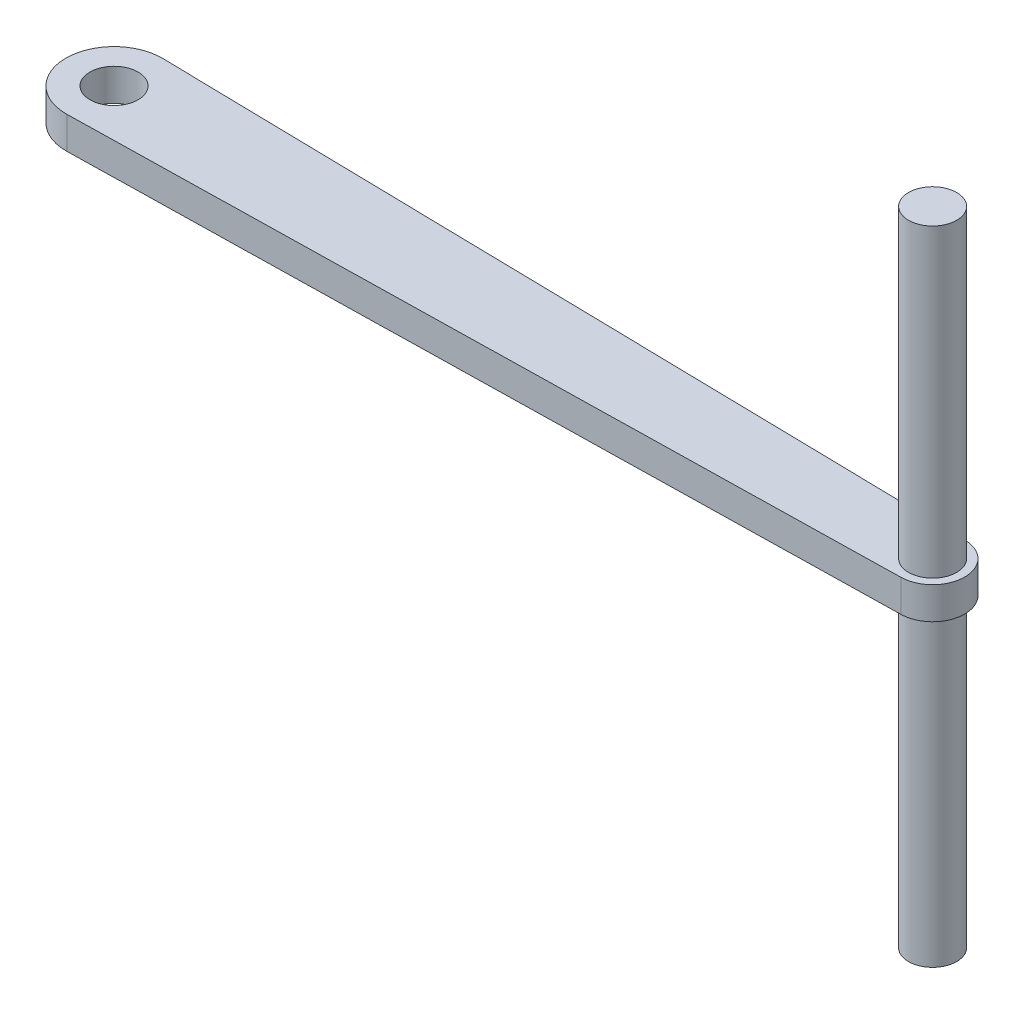
ISO-10303-21;
HEADER;
FILE_DESCRIPTION(('STEP AP214'),'2;1');
FILE_NAME('part.step','',(''),(''),'','','');
FILE_SCHEMA(('AUTOMOTIVE_DESIGN { 1 0 10303 214 1 1 1 1 }'));
ENDSEC;
DATA;
#1=APPLICATION_CONTEXT('core data for automotive mechanical design processes');
#2=APPLICATION_PROTOCOL_DEFINITION('international standard','automotive_design',2000,#1);
#3=PRODUCT_CONTEXT('',#1,'mechanical');
#4=PRODUCT('Part','Part','',(#3));
#5=PRODUCT_RELATED_PRODUCT_CATEGORY('part','',(#4));
#6=PRODUCT_DEFINITION_FORMATION('','',#4);
#7=PRODUCT_DEFINITION_CONTEXT('part definition',#1,'design');
#8=PRODUCT_DEFINITION('design','',#6,#7);
#9=PRODUCT_DEFINITION_SHAPE('','',#8);
#10=(LENGTH_UNIT() NAMED_UNIT(*) SI_UNIT(.MILLI.,.METRE.));
#11=(NAMED_UNIT(*) PLANE_ANGLE_UNIT() SI_UNIT($,.RADIAN.));
#12=(NAMED_UNIT(*) SI_UNIT($,.STERADIAN.) SOLID_ANGLE_UNIT());
#13=UNCERTAINTY_MEASURE_WITH_UNIT(LENGTH_MEASURE(1.E-05),#10,'distance_accuracy_value','');
#14=(GEOMETRIC_REPRESENTATION_CONTEXT(3) GLOBAL_UNCERTAINTY_ASSIGNED_CONTEXT((#13)) GLOBAL_UNIT_ASSIGNED_CONTEXT((#10,
#11,#12)) REPRESENTATION_CONTEXT('',''));
#15=CARTESIAN_POINT('',(0.,0.,0.));
#16=DIRECTION('',(0.,0.,1.));
#17=DIRECTION('',(1.,0.,0.));
#18=AXIS2_PLACEMENT_3D('',#15,#16,#17);
#19=CARTESIAN_POINT('',(0.,20.,0.));
#20=DIRECTION('',(0.,-1.,0.));
#21=DIRECTION('',(0.,0.,-1.));
#22=AXIS2_PLACEMENT_3D('',#19,#20,#21);
#23=CYLINDRICAL_SURFACE('',#22,1.5);
#24=CARTESIAN_POINT('',(0.,1.,0.));
#25=DIRECTION('',(0.,1.,0.));
#26=DIRECTION('',(0.,0.,1.));
#27=AXIS2_PLACEMENT_3D('',#24,#25,#26);
#28=CIRCLE('',#27,1.5);
#29=CARTESIAN_POINT('',(0.,1.,1.5));
#30=VERTEX_POINT('',#29);
#31=EDGE_CURVE('E44',#30,#30,#28,.T.);
#32=ORIENTED_EDGE('',*,*,#31,.T.);
#33=EDGE_LOOP('',(#32));
#34=FACE_BOUND('',#33,.T.);
#35=CARTESIAN_POINT('',(0.,20.,0.));
#36=DIRECTION('',(0.,1.,0.));
#37=DIRECTION('',(0.,0.,1.));
#38=AXIS2_PLACEMENT_3D('',#35,#36,#37);
#39=CIRCLE('',#38,1.5);
#40=CARTESIAN_POINT('',(0.,20.,1.5));
#41=VERTEX_POINT('',#40);
#42=EDGE_CURVE('E51',#41,#41,#39,.T.);
#43=ORIENTED_EDGE('',*,*,#42,.F.);
#44=EDGE_LOOP('',(#43));
#45=FACE_BOUND('',#44,.T.);
#46=ADVANCED_FACE('F41',(#34,#45),#23,.T.);
#47=CARTESIAN_POINT('',(0.,20.,0.));
#48=DIRECTION('',(0.,1.,0.));
#49=DIRECTION('',(0.,0.,1.));
#50=AXIS2_PLACEMENT_3D('',#47,#48,#49);
#51=PLANE('',#50);
#52=ORIENTED_EDGE('',*,*,#42,.T.);
#53=EDGE_LOOP('',(#52));
#54=FACE_BOUND('',#53,.T.);
#55=ADVANCED_FACE('F148',(#54),#51,.T.);
#56=CARTESIAN_POINT('',(-51.,1.,0.));
#57=DIRECTION('',(0.,1.,0.));
#58=DIRECTION('',(0.,0.,1.));
#59=AXIS2_PLACEMENT_3D('',#56,#57,#58);
#60=PLANE('',#59);
#61=ORIENTED_EDGE('',*,*,#31,.F.);
#62=EDGE_LOOP('',(#61));
#63=FACE_BOUND('',#62,.T.);
#64=CARTESIAN_POINT('',(-51.,1.,0.));
#65=DIRECTION('',(0.,1.,0.));
#66=DIRECTION('',(0.,0.,1.));
#67=AXIS2_PLACEMENT_3D('',#64,#65,#66);
#68=CIRCLE('',#67,3.);
#69=CARTESIAN_POINT('',(-50.9411764705882,1.,-2.99942324328987));
#70=VERTEX_POINT('',#69);
#71=CARTESIAN_POINT('',(-50.9411764705882,1.,2.99942324328987));
#72=VERTEX_POINT('',#71);
#73=EDGE_CURVE('E96',#70,#72,#68,.T.);
#74=ORIENTED_EDGE('',*,*,#73,.T.);
#75=DIRECTION('',(0.999807747763291,0.,-0.0196078431372549));
#76=VECTOR('',#75,1.);
#77=CARTESIAN_POINT('',(-50.9411764705882,1.,2.99942324328987));
#78=LINE('',#77,#76);
#79=CARTESIAN_POINT('',(0.0392156862745099,1.,1.99961549552658));
#80=VERTEX_POINT('',#79);
#81=EDGE_CURVE('E90',#72,#80,#78,.T.);
#82=ORIENTED_EDGE('',*,*,#81,.T.);
#83=CARTESIAN_POINT('',(0.,1.,0.));
#84=DIRECTION('',(0.,1.,0.));
#85=DIRECTION('',(0.,0.,1.));
#86=AXIS2_PLACEMENT_3D('',#83,#84,#85);
#87=CIRCLE('',#86,2.);
#88=CARTESIAN_POINT('',(0.0392156862745099,1.,-1.99961549552658));
#89=VERTEX_POINT('',#88);
#90=EDGE_CURVE('E94',#80,#89,#87,.T.);
#91=ORIENTED_EDGE('',*,*,#90,.T.);
#92=DIRECTION('',(-0.999807747763291,0.,-0.0196078431372549));
#93=VECTOR('',#92,1.);
#94=CARTESIAN_POINT('',(-50.9411764705882,1.,-2.99942324328987));
#95=LINE('',#94,#93);
#96=EDGE_CURVE('E59',#89,#70,#95,.T.);
#97=ORIENTED_EDGE('',*,*,#96,.T.);
#98=EDGE_LOOP('',(#74,#82,#91,#97));
#99=FACE_BOUND('',#98,.T.);
#100=CARTESIAN_POINT('',(-51.,1.,0.));
#101=DIRECTION('',(0.,1.,0.));
#102=DIRECTION('',(0.,0.,1.));
#103=AXIS2_PLACEMENT_3D('',#100,#101,#102);
#104=CIRCLE('',#103,1.5);
#105=CARTESIAN_POINT('',(-51.,1.,1.5));
#106=VERTEX_POINT('',#105);
#107=EDGE_CURVE('E119',#106,#106,#104,.T.);
#108=ORIENTED_EDGE('',*,*,#107,.F.);
#109=EDGE_LOOP('',(#108));
#110=FACE_BOUND('',#109,.T.);
#111=ADVANCED_FACE('F91',(#63,#99,#110),#60,.T.);
#112=CARTESIAN_POINT('',(-51.,-1.,0.));
#113=DIRECTION('',(0.,1.,0.));
#114=DIRECTION('',(0.,0.,1.));
#115=AXIS2_PLACEMENT_3D('',#112,#113,#114);
#116=PLANE('',#115);
#117=CARTESIAN_POINT('',(0.,-1.,0.));
#118=DIRECTION('',(0.,1.,0.));
#119=DIRECTION('',(0.,0.,1.));
#120=AXIS2_PLACEMENT_3D('',#117,#118,#119);
#121=CIRCLE('',#120,1.5);
#122=CARTESIAN_POINT('',(0.,-1.,1.5));
#123=VERTEX_POINT('',#122);
#124=EDGE_CURVE('E11',#123,#123,#121,.T.);
#125=ORIENTED_EDGE('',*,*,#124,.T.);
#126=EDGE_LOOP('',(#125));
#127=FACE_BOUND('',#126,.T.);
#128=CARTESIAN_POINT('',(-51.,-1.,0.));
#129=DIRECTION('',(0.,1.,0.));
#130=DIRECTION('',(0.,0.,1.));
#131=AXIS2_PLACEMENT_3D('',#128,#129,#130);
#132=CIRCLE('',#131,3.);
#133=CARTESIAN_POINT('',(-50.9411764705882,-1.,-2.99942324328987));
#134=VERTEX_POINT('',#133);
#135=CARTESIAN_POINT('',(-50.9411764705882,-1.,2.99942324328987));
#136=VERTEX_POINT('',#135);
#137=EDGE_CURVE('E115',#134,#136,#132,.T.);
#138=ORIENTED_EDGE('',*,*,#137,.F.);
#139=DIRECTION('',(-0.999807747763291,0.,-0.0196078431372549));
#140=VECTOR('',#139,1.);
#141=CARTESIAN_POINT('',(-50.9411764705882,-1.,-2.99942324328987));
#142=LINE('',#141,#140);
#143=CARTESIAN_POINT('',(0.0392156862745099,-1.,-1.99961549552658));
#144=VERTEX_POINT('',#143);
#145=EDGE_CURVE('E82',#144,#134,#142,.T.);
#146=ORIENTED_EDGE('',*,*,#145,.F.);
#147=CARTESIAN_POINT('',(0.,-1.,0.));
#148=DIRECTION('',(0.,1.,0.));
#149=DIRECTION('',(0.,0.,1.));
#150=AXIS2_PLACEMENT_3D('',#147,#148,#149);
#151=CIRCLE('',#150,2.);
#152=CARTESIAN_POINT('',(0.0392156862745099,-1.,1.99961549552658));
#153=VERTEX_POINT('',#152);
#154=EDGE_CURVE('E76',#153,#144,#151,.T.);
#155=ORIENTED_EDGE('',*,*,#154,.F.);
#156=DIRECTION('',(0.999807747763291,0.,-0.0196078431372549));
#157=VECTOR('',#156,1.);
#158=CARTESIAN_POINT('',(-50.9411764705882,-1.,2.99942324328987));
#159=LINE('',#158,#157);
#160=EDGE_CURVE('E102',#136,#153,#159,.T.);
#161=ORIENTED_EDGE('',*,*,#160,.F.);
#162=EDGE_LOOP('',(#138,#146,#155,#161));
#163=FACE_BOUND('',#162,.T.);
#164=CARTESIAN_POINT('',(-51.,-1.,0.));
#165=DIRECTION('',(0.,1.,0.));
#166=DIRECTION('',(0.,0.,1.));
#167=AXIS2_PLACEMENT_3D('',#164,#165,#166);
#168=CIRCLE('',#167,1.5);
#169=CARTESIAN_POINT('',(-51.,-1.,1.5));
#170=VERTEX_POINT('',#169);
#171=EDGE_CURVE('E178',#170,#170,#168,.T.);
#172=ORIENTED_EDGE('',*,*,#171,.T.);
#173=EDGE_LOOP('',(#172));
#174=FACE_BOUND('',#173,.T.);
#175=ADVANCED_FACE('F147',(#127,#163,#174),#116,.F.);
#176=CARTESIAN_POINT('',(-51.,1.,0.));
#177=DIRECTION('',(0.,-1.,0.));
#178=DIRECTION('',(0.,0.,-1.));
#179=AXIS2_PLACEMENT_3D('',#176,#177,#178);
#180=CYLINDRICAL_SURFACE('',#179,3.);
#181=ORIENTED_EDGE('',*,*,#137,.T.);
#182=DIRECTION('',(0.,-1.,0.));
#183=VECTOR('',#182,1.);
#184=CARTESIAN_POINT('',(-50.9411764705882,1.,2.99942324328987));
#185=LINE('',#184,#183);
#186=EDGE_CURVE('E104',#72,#136,#185,.T.);
#187=ORIENTED_EDGE('',*,*,#186,.F.);
#188=ORIENTED_EDGE('',*,*,#73,.F.);
#189=DIRECTION('',(0.,-1.,0.));
#190=VECTOR('',#189,1.);
#191=CARTESIAN_POINT('',(-50.9411764705882,1.,-2.99942324328987));
#192=LINE('',#191,#190);
#193=EDGE_CURVE('E111',#70,#134,#192,.T.);
#194=ORIENTED_EDGE('',*,*,#193,.T.);
#195=EDGE_LOOP('',(#181,#187,#188,#194));
#196=FACE_BOUND('',#195,.T.);
#197=ADVANCED_FACE('F154',(#196),#180,.T.);
#198=CARTESIAN_POINT('',(-50.9411764705882,1.,2.99942324328987));
#199=DIRECTION('',(-0.0196078431372549,0.,-0.999807747763291));
#200=DIRECTION('',(-0.999807747763291,0.,0.0196078431372549));
#201=AXIS2_PLACEMENT_3D('',#198,#199,#200);
#202=PLANE('',#201);
#203=ORIENTED_EDGE('',*,*,#160,.T.);
#204=DIRECTION('',(0.,-1.,0.));
#205=VECTOR('',#204,1.);
#206=CARTESIAN_POINT('',(0.0392156862745099,1.,1.99961549552658));
#207=LINE('',#206,#205);
#208=EDGE_CURVE('E100',#80,#153,#207,.T.);
#209=ORIENTED_EDGE('',*,*,#208,.F.);
#210=ORIENTED_EDGE('',*,*,#81,.F.);
#211=ORIENTED_EDGE('',*,*,#186,.T.);
#212=EDGE_LOOP('',(#203,#209,#210,#211));
#213=FACE_BOUND('',#212,.T.);
#214=ADVANCED_FACE('F101',(#213),#202,.F.);
#215=CARTESIAN_POINT('',(0.,1.,0.));
#216=DIRECTION('',(0.,-1.,0.));
#217=DIRECTION('',(0.,0.,-1.));
#218=AXIS2_PLACEMENT_3D('',#215,#216,#217);
#219=CYLINDRICAL_SURFACE('',#218,2.);
#220=ORIENTED_EDGE('',*,*,#154,.T.);
#221=DIRECTION('',(0.,-1.,0.));
#222=VECTOR('',#221,1.);
#223=CARTESIAN_POINT('',(0.0392156862745099,1.,-1.99961549552658));
#224=LINE('',#223,#222);
#225=EDGE_CURVE('E105',#89,#144,#224,.T.);
#226=ORIENTED_EDGE('',*,*,#225,.F.);
#227=ORIENTED_EDGE('',*,*,#90,.F.);
#228=ORIENTED_EDGE('',*,*,#208,.T.);
#229=EDGE_LOOP('',(#220,#226,#227,#228));
#230=FACE_BOUND('',#229,.T.);
#231=ADVANCED_FACE('F107',(#230),#219,.T.);
#232=CARTESIAN_POINT('',(-50.9411764705882,1.,-2.99942324328987));
#233=DIRECTION('',(-0.0196078431372549,0.,0.999807747763291));
#234=DIRECTION('',(0.999807747763291,0.,0.0196078431372549));
#235=AXIS2_PLACEMENT_3D('',#232,#233,#234);
#236=PLANE('',#235);
#237=ORIENTED_EDGE('',*,*,#145,.T.);
#238=ORIENTED_EDGE('',*,*,#193,.F.);
#239=ORIENTED_EDGE('',*,*,#96,.F.);
#240=ORIENTED_EDGE('',*,*,#225,.T.);
#241=EDGE_LOOP('',(#237,#238,#239,#240));
#242=FACE_BOUND('',#241,.T.);
#243=ADVANCED_FACE('F189',(#242),#236,.F.);
#244=CARTESIAN_POINT('',(-51.,1.,0.));
#245=DIRECTION('',(0.,-1.,0.));
#246=DIRECTION('',(0.,0.,-1.));
#247=AXIS2_PLACEMENT_3D('',#244,#245,#246);
#248=CYLINDRICAL_SURFACE('',#247,1.5);
#249=ORIENTED_EDGE('',*,*,#107,.T.);
#250=EDGE_LOOP('',(#249));
#251=FACE_BOUND('',#250,.T.);
#252=ORIENTED_EDGE('',*,*,#171,.F.);
#253=EDGE_LOOP('',(#252));
#254=FACE_BOUND('',#253,.T.);
#255=ADVANCED_FACE('F169',(#251,#254),#248,.F.);
#256=CARTESIAN_POINT('',(0.,-20.,0.));
#257=DIRECTION('',(0.,1.,0.));
#258=DIRECTION('',(0.,0.,1.));
#259=AXIS2_PLACEMENT_3D('',#256,#257,#258);
#260=PLANE('',#259);
#261=CARTESIAN_POINT('',(0.,-20.,0.));
#262=DIRECTION('',(0.,1.,0.));
#263=DIRECTION('',(0.,0.,1.));
#264=AXIS2_PLACEMENT_3D('',#261,#262,#263);
#265=CIRCLE('',#264,1.5);
#266=CARTESIAN_POINT('',(0.,-20.,1.5));
#267=VERTEX_POINT('',#266);
#268=EDGE_CURVE('E135',#267,#267,#265,.T.);
#269=ORIENTED_EDGE('',*,*,#268,.F.);
#270=EDGE_LOOP('',(#269));
#271=FACE_BOUND('',#270,.T.);
#272=ADVANCED_FACE('F165',(#271),#260,.F.);
#273=ORIENTED_EDGE('',*,*,#268,.T.);
#274=EDGE_LOOP('',(#273));
#275=FACE_BOUND('',#274,.T.);
#276=ORIENTED_EDGE('',*,*,#124,.F.);
#277=EDGE_LOOP('',(#276));
#278=FACE_BOUND('',#277,.T.);
#279=ADVANCED_FACE('F161',(#275,#278),#23,.T.);
#280=CLOSED_SHELL('',(#46,#55,#111,#175,#197,#214,#231,#243,#255,#272,#279));
#281=MANIFOLD_SOLID_BREP('B2',#280);
#282=ADVANCED_BREP_SHAPE_REPRESENTATION('',(#18,#281),#14);
#283=SHAPE_DEFINITION_REPRESENTATION(#9,#282);
ENDSEC;
END-ISO-10303-21;
